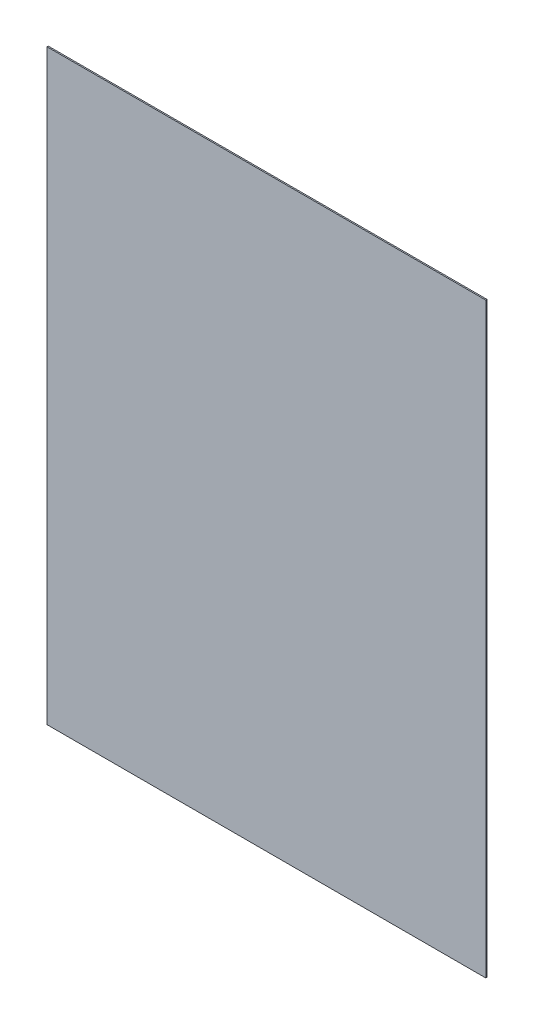
ISO-10303-21;
HEADER;
FILE_DESCRIPTION(('STEP AP214'),'2;1');
FILE_NAME('part.step','',(''),(''),'','','');
FILE_SCHEMA(('AUTOMOTIVE_DESIGN { 1 0 10303 214 1 1 1 1 }'));
ENDSEC;
DATA;
#1=APPLICATION_CONTEXT('core data for automotive mechanical design processes');
#2=APPLICATION_PROTOCOL_DEFINITION('international standard','automotive_design',2000,#1);
#3=PRODUCT_CONTEXT('',#1,'mechanical');
#4=PRODUCT('Part','Part','',(#3));
#5=PRODUCT_RELATED_PRODUCT_CATEGORY('part','',(#4));
#6=PRODUCT_DEFINITION_FORMATION('','',#4);
#7=PRODUCT_DEFINITION_CONTEXT('part definition',#1,'design');
#8=PRODUCT_DEFINITION('design','',#6,#7);
#9=PRODUCT_DEFINITION_SHAPE('','',#8);
#10=(LENGTH_UNIT() NAMED_UNIT(*) SI_UNIT(.MILLI.,.METRE.));
#11=(NAMED_UNIT(*) PLANE_ANGLE_UNIT() SI_UNIT($,.RADIAN.));
#12=(NAMED_UNIT(*) SI_UNIT($,.STERADIAN.) SOLID_ANGLE_UNIT());
#13=UNCERTAINTY_MEASURE_WITH_UNIT(LENGTH_MEASURE(1.E-05),#10,'distance_accuracy_value','');
#14=(GEOMETRIC_REPRESENTATION_CONTEXT(3) GLOBAL_UNCERTAINTY_ASSIGNED_CONTEXT((#13)) GLOBAL_UNIT_ASSIGNED_CONTEXT((#10,
#11,#12)) REPRESENTATION_CONTEXT('',''));
#15=CARTESIAN_POINT('',(0.,0.,0.));
#16=DIRECTION('',(0.,0.,1.));
#17=DIRECTION('',(1.,0.,0.));
#18=AXIS2_PLACEMENT_3D('',#15,#16,#17);
#19=CARTESIAN_POINT('',(46.2837837837838,162.5,1.));
#20=DIRECTION('',(-1.,0.,0.));
#21=DIRECTION('',(0.,-1.,0.));
#22=AXIS2_PLACEMENT_3D('',#19,#20,#21);
#23=PLANE('',#22);
#24=DIRECTION('',(0.,1.,0.));
#25=VECTOR('',#24,1.);
#26=CARTESIAN_POINT('',(46.2837837837838,162.5,0.));
#27=LINE('',#26,#25);
#28=CARTESIAN_POINT('',(46.2837837837838,-307.5,0.));
#29=VERTEX_POINT('',#28);
#30=CARTESIAN_POINT('',(46.2837837837838,162.5,0.));
#31=VERTEX_POINT('',#30);
#32=EDGE_CURVE('E103',#29,#31,#27,.T.);
#33=ORIENTED_EDGE('',*,*,#32,.T.);
#34=DIRECTION('',(0.,0.,-1.));
#35=VECTOR('',#34,1.);
#36=CARTESIAN_POINT('',(46.2837837837838,162.5,1.));
#37=LINE('',#36,#35);
#38=CARTESIAN_POINT('',(46.2837837837838,162.5,1.));
#39=VERTEX_POINT('',#38);
#40=EDGE_CURVE('E11',#39,#31,#37,.T.);
#41=ORIENTED_EDGE('',*,*,#40,.F.);
#42=DIRECTION('',(0.,1.,0.));
#43=VECTOR('',#42,1.);
#44=CARTESIAN_POINT('',(46.2837837837838,162.5,1.));
#45=LINE('',#44,#43);
#46=CARTESIAN_POINT('',(46.2837837837838,-307.5,1.));
#47=VERTEX_POINT('',#46);
#48=EDGE_CURVE('E91',#47,#39,#45,.T.);
#49=ORIENTED_EDGE('',*,*,#48,.F.);
#50=DIRECTION('',(0.,0.,-1.));
#51=VECTOR('',#50,1.);
#52=CARTESIAN_POINT('',(46.2837837837838,-307.5,1.));
#53=LINE('',#52,#51);
#54=EDGE_CURVE('E99',#47,#29,#53,.T.);
#55=ORIENTED_EDGE('',*,*,#54,.T.);
#56=EDGE_LOOP('',(#33,#41,#49,#55));
#57=FACE_BOUND('',#56,.T.);
#58=ADVANCED_FACE('F40',(#57),#23,.F.);
#59=CARTESIAN_POINT('',(-305.056216216216,162.5,1.));
#60=DIRECTION('',(0.,-1.,0.));
#61=DIRECTION('',(0.,0.,-1.));
#62=AXIS2_PLACEMENT_3D('',#59,#60,#61);
#63=PLANE('',#62);
#64=DIRECTION('',(-1.,0.,0.));
#65=VECTOR('',#64,1.);
#66=CARTESIAN_POINT('',(-305.056216216216,162.5,0.));
#67=LINE('',#66,#65);
#68=CARTESIAN_POINT('',(-305.056216216216,162.5,0.));
#69=VERTEX_POINT('',#68);
#70=EDGE_CURVE('E95',#31,#69,#67,.T.);
#71=ORIENTED_EDGE('',*,*,#70,.T.);
#72=DIRECTION('',(0.,0.,-1.));
#73=VECTOR('',#72,1.);
#74=CARTESIAN_POINT('',(-305.056216216216,162.5,1.));
#75=LINE('',#74,#73);
#76=CARTESIAN_POINT('',(-305.056216216216,162.5,1.));
#77=VERTEX_POINT('',#76);
#78=EDGE_CURVE('E48',#77,#69,#75,.T.);
#79=ORIENTED_EDGE('',*,*,#78,.F.);
#80=DIRECTION('',(-1.,0.,0.));
#81=VECTOR('',#80,1.);
#82=CARTESIAN_POINT('',(-305.056216216216,162.5,1.));
#83=LINE('',#82,#81);
#84=EDGE_CURVE('E86',#39,#77,#83,.T.);
#85=ORIENTED_EDGE('',*,*,#84,.F.);
#86=ORIENTED_EDGE('',*,*,#40,.T.);
#87=EDGE_LOOP('',(#71,#79,#85,#86));
#88=FACE_BOUND('',#87,.T.);
#89=ADVANCED_FACE('F94',(#88),#63,.F.);
#90=CARTESIAN_POINT('',(-305.056216216216,162.5,1.));
#91=DIRECTION('',(1.,0.,0.));
#92=DIRECTION('',(0.,1.,0.));
#93=AXIS2_PLACEMENT_3D('',#90,#91,#92);
#94=PLANE('',#93);
#95=DIRECTION('',(0.,-1.,0.));
#96=VECTOR('',#95,1.);
#97=CARTESIAN_POINT('',(-305.056216216216,162.5,0.));
#98=LINE('',#97,#96);
#99=CARTESIAN_POINT('',(-305.056216216216,-307.5,0.));
#100=VERTEX_POINT('',#99);
#101=EDGE_CURVE('E73',#69,#100,#98,.T.);
#102=ORIENTED_EDGE('',*,*,#101,.T.);
#103=DIRECTION('',(0.,0.,-1.));
#104=VECTOR('',#103,1.);
#105=CARTESIAN_POINT('',(-305.056216216216,-307.5,1.));
#106=LINE('',#105,#104);
#107=CARTESIAN_POINT('',(-305.056216216216,-307.5,1.));
#108=VERTEX_POINT('',#107);
#109=EDGE_CURVE('E96',#108,#100,#106,.T.);
#110=ORIENTED_EDGE('',*,*,#109,.F.);
#111=DIRECTION('',(0.,-1.,0.));
#112=VECTOR('',#111,1.);
#113=CARTESIAN_POINT('',(-305.056216216216,162.5,1.));
#114=LINE('',#113,#112);
#115=EDGE_CURVE('E89',#77,#108,#114,.T.);
#116=ORIENTED_EDGE('',*,*,#115,.F.);
#117=ORIENTED_EDGE('',*,*,#78,.T.);
#118=EDGE_LOOP('',(#102,#110,#116,#117));
#119=FACE_BOUND('',#118,.T.);
#120=ADVANCED_FACE('F97',(#119),#94,.F.);
#121=CARTESIAN_POINT('',(-305.056216216216,-307.5,1.));
#122=DIRECTION('',(0.,1.,0.));
#123=DIRECTION('',(0.,0.,1.));
#124=AXIS2_PLACEMENT_3D('',#121,#122,#123);
#125=PLANE('',#124);
#126=DIRECTION('',(1.,0.,0.));
#127=VECTOR('',#126,1.);
#128=CARTESIAN_POINT('',(-305.056216216216,-307.5,0.));
#129=LINE('',#128,#127);
#130=EDGE_CURVE('E79',#100,#29,#129,.T.);
#131=ORIENTED_EDGE('',*,*,#130,.T.);
#132=ORIENTED_EDGE('',*,*,#54,.F.);
#133=DIRECTION('',(1.,0.,0.));
#134=VECTOR('',#133,1.);
#135=CARTESIAN_POINT('',(-305.056216216216,-307.5,1.));
#136=LINE('',#135,#134);
#137=EDGE_CURVE('E56',#108,#47,#136,.T.);
#138=ORIENTED_EDGE('',*,*,#137,.F.);
#139=ORIENTED_EDGE('',*,*,#109,.T.);
#140=EDGE_LOOP('',(#131,#132,#138,#139));
#141=FACE_BOUND('',#140,.T.);
#142=ADVANCED_FACE('F110',(#141),#125,.F.);
#143=CARTESIAN_POINT('',(0.,0.,1.));
#144=DIRECTION('',(0.,0.,1.));
#145=DIRECTION('',(1.,0.,0.));
#146=AXIS2_PLACEMENT_3D('',#143,#144,#145);
#147=PLANE('',#146);
#148=ORIENTED_EDGE('',*,*,#48,.T.);
#149=ORIENTED_EDGE('',*,*,#84,.T.);
#150=ORIENTED_EDGE('',*,*,#115,.T.);
#151=ORIENTED_EDGE('',*,*,#137,.T.);
#152=EDGE_LOOP('',(#148,#149,#150,#151));
#153=FACE_BOUND('',#152,.T.);
#154=ADVANCED_FACE('F87',(#153),#147,.T.);
#155=CARTESIAN_POINT('',(0.,0.,0.));
#156=DIRECTION('',(0.,0.,1.));
#157=DIRECTION('',(1.,0.,0.));
#158=AXIS2_PLACEMENT_3D('',#155,#156,#157);
#159=PLANE('',#158);
#160=ORIENTED_EDGE('',*,*,#32,.F.);
#161=ORIENTED_EDGE('',*,*,#130,.F.);
#162=ORIENTED_EDGE('',*,*,#101,.F.);
#163=ORIENTED_EDGE('',*,*,#70,.F.);
#164=EDGE_LOOP('',(#160,#161,#162,#163));
#165=FACE_BOUND('',#164,.T.);
#166=ADVANCED_FACE('F113',(#165),#159,.F.);
#167=CLOSED_SHELL('',(#58,#89,#120,#142,#154,#166));
#168=MANIFOLD_SOLID_BREP('B2',#167);
#169=ADVANCED_BREP_SHAPE_REPRESENTATION('',(#18,#168),#14);
#170=SHAPE_DEFINITION_REPRESENTATION(#9,#169);
ENDSEC;
END-ISO-10303-21;
